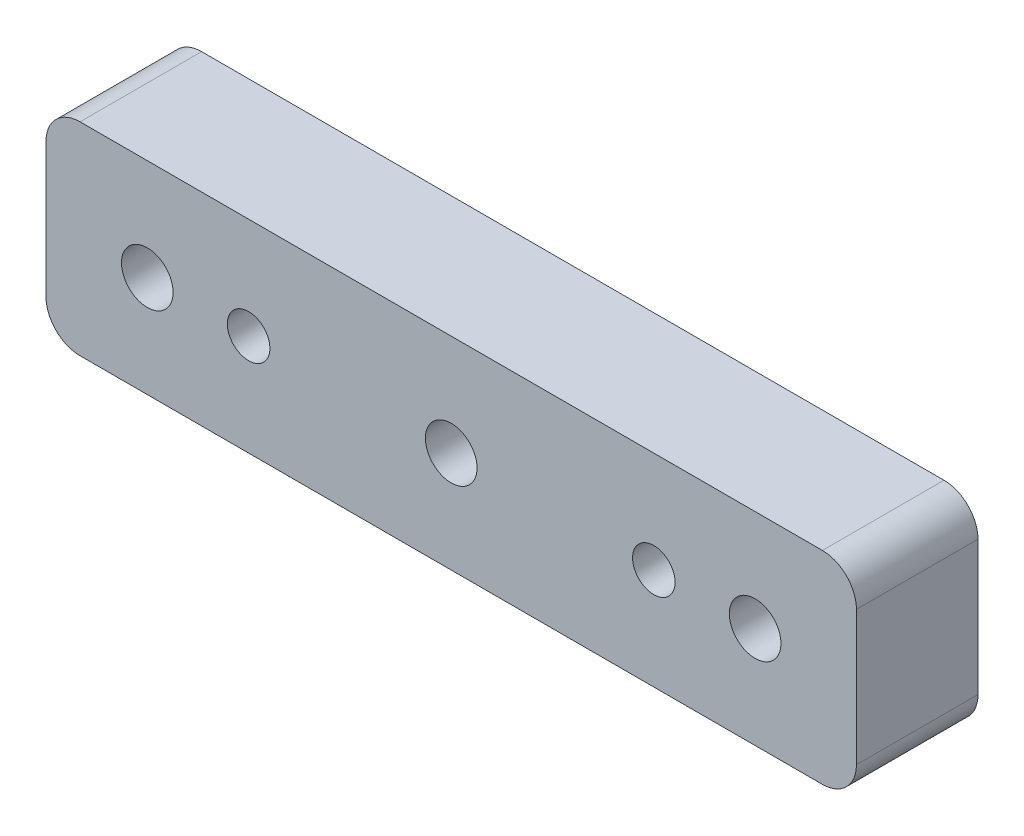
ISO-10303-21;
HEADER;
FILE_DESCRIPTION(('STEP AP214'),'2;1');
FILE_NAME('part.step','',(''),(''),'','','');
FILE_SCHEMA(('AUTOMOTIVE_DESIGN { 1 0 10303 214 1 1 1 1 }'));
ENDSEC;
DATA;
#1=APPLICATION_CONTEXT('core data for automotive mechanical design processes');
#2=APPLICATION_PROTOCOL_DEFINITION('international standard','automotive_design',2000,#1);
#3=PRODUCT_CONTEXT('',#1,'mechanical');
#4=PRODUCT('Part','Part','',(#3));
#5=PRODUCT_RELATED_PRODUCT_CATEGORY('part','',(#4));
#6=PRODUCT_DEFINITION_FORMATION('','',#4);
#7=PRODUCT_DEFINITION_CONTEXT('part definition',#1,'design');
#8=PRODUCT_DEFINITION('design','',#6,#7);
#9=PRODUCT_DEFINITION_SHAPE('','',#8);
#10=(LENGTH_UNIT() NAMED_UNIT(*) SI_UNIT(.MILLI.,.METRE.));
#11=(NAMED_UNIT(*) PLANE_ANGLE_UNIT() SI_UNIT($,.RADIAN.));
#12=(NAMED_UNIT(*) SI_UNIT($,.STERADIAN.) SOLID_ANGLE_UNIT());
#13=UNCERTAINTY_MEASURE_WITH_UNIT(LENGTH_MEASURE(1.E-05),#10,'distance_accuracy_value','');
#14=(GEOMETRIC_REPRESENTATION_CONTEXT(3) GLOBAL_UNCERTAINTY_ASSIGNED_CONTEXT((#13)) GLOBAL_UNIT_ASSIGNED_CONTEXT((#10,
#11,#12)) REPRESENTATION_CONTEXT('',''));
#15=CARTESIAN_POINT('',(0.,0.,0.));
#16=DIRECTION('',(0.,0.,1.));
#17=DIRECTION('',(1.,0.,0.));
#18=AXIS2_PLACEMENT_3D('',#15,#16,#17);
#19=CARTESIAN_POINT('',(36.64,6.64000000000001,12.));
#20=DIRECTION('',(0.,0.,-1.));
#21=DIRECTION('',(-1.,0.,0.));
#22=AXIS2_PLACEMENT_3D('',#19,#20,#21);
#23=CYLINDRICAL_SURFACE('',#22,3.36);
#24=CARTESIAN_POINT('',(36.64,6.64000000000001,0.));
#25=DIRECTION('',(0.,0.,1.));
#26=DIRECTION('',(1.,0.,0.));
#27=AXIS2_PLACEMENT_3D('',#24,#25,#26);
#28=CIRCLE('',#27,3.36);
#29=CARTESIAN_POINT('',(40.,6.64000000000001,0.));
#30=VERTEX_POINT('',#29);
#31=CARTESIAN_POINT('',(36.64,10.,0.));
#32=VERTEX_POINT('',#31);
#33=EDGE_CURVE('E131',#30,#32,#28,.T.);
#34=ORIENTED_EDGE('',*,*,#33,.T.);
#35=DIRECTION('',(0.,0.,-1.));
#36=VECTOR('',#35,1.);
#37=CARTESIAN_POINT('',(36.64,10.,12.));
#38=LINE('',#37,#36);
#39=CARTESIAN_POINT('',(36.64,10.,12.));
#40=VERTEX_POINT('',#39);
#41=EDGE_CURVE('E11',#40,#32,#38,.T.);
#42=ORIENTED_EDGE('',*,*,#41,.F.);
#43=CARTESIAN_POINT('',(36.64,6.64000000000001,12.));
#44=DIRECTION('',(0.,0.,1.));
#45=DIRECTION('',(1.,0.,0.));
#46=AXIS2_PLACEMENT_3D('',#43,#44,#45);
#47=CIRCLE('',#46,3.36);
#48=CARTESIAN_POINT('',(40.,6.64000000000001,12.));
#49=VERTEX_POINT('',#48);
#50=EDGE_CURVE('E146',#49,#40,#47,.T.);
#51=ORIENTED_EDGE('',*,*,#50,.F.);
#52=DIRECTION('',(0.,0.,-1.));
#53=VECTOR('',#52,1.);
#54=CARTESIAN_POINT('',(40.,6.64000000000001,12.));
#55=LINE('',#54,#53);
#56=EDGE_CURVE('E127',#49,#30,#55,.T.);
#57=ORIENTED_EDGE('',*,*,#56,.T.);
#58=EDGE_LOOP('',(#34,#42,#51,#57));
#59=FACE_BOUND('',#58,.T.);
#60=ADVANCED_FACE('F35',(#59),#23,.T.);
#61=CARTESIAN_POINT('',(36.64,10.,12.));
#62=DIRECTION('',(0.,-1.,0.));
#63=DIRECTION('',(1.,0.,0.));
#64=AXIS2_PLACEMENT_3D('',#61,#62,#63);
#65=PLANE('',#64);
#66=DIRECTION('',(-1.,0.,0.));
#67=VECTOR('',#66,1.);
#68=CARTESIAN_POINT('',(36.64,10.,0.));
#69=LINE('',#68,#67);
#70=CARTESIAN_POINT('',(-36.64,10.,0.));
#71=VERTEX_POINT('',#70);
#72=EDGE_CURVE('E134',#32,#71,#69,.T.);
#73=ORIENTED_EDGE('',*,*,#72,.T.);
#74=DIRECTION('',(0.,0.,-1.));
#75=VECTOR('',#74,1.);
#76=CARTESIAN_POINT('',(-36.64,10.,12.));
#77=LINE('',#76,#75);
#78=CARTESIAN_POINT('',(-36.64,10.,12.));
#79=VERTEX_POINT('',#78);
#80=EDGE_CURVE('E43',#79,#71,#77,.T.);
#81=ORIENTED_EDGE('',*,*,#80,.F.);
#82=DIRECTION('',(-1.,0.,0.));
#83=VECTOR('',#82,1.);
#84=CARTESIAN_POINT('',(36.64,10.,12.));
#85=LINE('',#84,#83);
#86=EDGE_CURVE('E94',#40,#79,#85,.T.);
#87=ORIENTED_EDGE('',*,*,#86,.F.);
#88=ORIENTED_EDGE('',*,*,#41,.T.);
#89=EDGE_LOOP('',(#73,#81,#87,#88));
#90=FACE_BOUND('',#89,.T.);
#91=ADVANCED_FACE('F239',(#90),#65,.F.);
#92=CARTESIAN_POINT('',(-36.64,6.64,12.));
#93=DIRECTION('',(0.,0.,-1.));
#94=DIRECTION('',(-1.,0.,0.));
#95=AXIS2_PLACEMENT_3D('',#92,#93,#94);
#96=CYLINDRICAL_SURFACE('',#95,3.36);
#97=CARTESIAN_POINT('',(-36.64,6.64,0.));
#98=DIRECTION('',(0.,0.,1.));
#99=DIRECTION('',(1.,0.,0.));
#100=AXIS2_PLACEMENT_3D('',#97,#98,#99);
#101=CIRCLE('',#100,3.36);
#102=CARTESIAN_POINT('',(-40.,6.64,0.));
#103=VERTEX_POINT('',#102);
#104=EDGE_CURVE('E137',#71,#103,#101,.T.);
#105=ORIENTED_EDGE('',*,*,#104,.T.);
#106=DIRECTION('',(0.,0.,-1.));
#107=VECTOR('',#106,1.);
#108=CARTESIAN_POINT('',(-40.,6.64,12.));
#109=LINE('',#108,#107);
#110=CARTESIAN_POINT('',(-40.,6.64,12.));
#111=VERTEX_POINT('',#110);
#112=EDGE_CURVE('E153',#111,#103,#109,.T.);
#113=ORIENTED_EDGE('',*,*,#112,.F.);
#114=CARTESIAN_POINT('',(-36.64,6.64,12.));
#115=DIRECTION('',(0.,0.,1.));
#116=DIRECTION('',(1.,0.,0.));
#117=AXIS2_PLACEMENT_3D('',#114,#115,#116);
#118=CIRCLE('',#117,3.36);
#119=EDGE_CURVE('E161',#79,#111,#118,.T.);
#120=ORIENTED_EDGE('',*,*,#119,.F.);
#121=ORIENTED_EDGE('',*,*,#80,.T.);
#122=EDGE_LOOP('',(#105,#113,#120,#121));
#123=FACE_BOUND('',#122,.T.);
#124=ADVANCED_FACE('F159',(#123),#96,.T.);
#125=CARTESIAN_POINT('',(-40.,-6.64,12.));
#126=DIRECTION('',(1.,0.,0.));
#127=DIRECTION('',(0.,0.,-1.));
#128=AXIS2_PLACEMENT_3D('',#125,#126,#127);
#129=PLANE('',#128);
#130=DIRECTION('',(0.,-1.,0.));
#131=VECTOR('',#130,1.);
#132=CARTESIAN_POINT('',(-40.,-6.64,0.));
#133=LINE('',#132,#131);
#134=CARTESIAN_POINT('',(-40.,-6.64,0.));
#135=VERTEX_POINT('',#134);
#136=EDGE_CURVE('E139',#103,#135,#133,.T.);
#137=ORIENTED_EDGE('',*,*,#136,.T.);
#138=DIRECTION('',(0.,0.,-1.));
#139=VECTOR('',#138,1.);
#140=CARTESIAN_POINT('',(-40.,-6.64,12.));
#141=LINE('',#140,#139);
#142=CARTESIAN_POINT('',(-40.,-6.64,12.));
#143=VERTEX_POINT('',#142);
#144=EDGE_CURVE('E150',#143,#135,#141,.T.);
#145=ORIENTED_EDGE('',*,*,#144,.F.);
#146=DIRECTION('',(0.,-1.,0.));
#147=VECTOR('',#146,1.);
#148=CARTESIAN_POINT('',(-40.,-6.64,12.));
#149=LINE('',#148,#147);
#150=EDGE_CURVE('E173',#111,#143,#149,.T.);
#151=ORIENTED_EDGE('',*,*,#150,.F.);
#152=ORIENTED_EDGE('',*,*,#112,.T.);
#153=EDGE_LOOP('',(#137,#145,#151,#152));
#154=FACE_BOUND('',#153,.T.);
#155=ADVANCED_FACE('F169',(#154),#129,.F.);
#156=CARTESIAN_POINT('',(-36.64,-6.64,12.));
#157=DIRECTION('',(0.,0.,-1.));
#158=DIRECTION('',(-1.,0.,0.));
#159=AXIS2_PLACEMENT_3D('',#156,#157,#158);
#160=CYLINDRICAL_SURFACE('',#159,3.36);
#161=CARTESIAN_POINT('',(-36.64,-6.64,0.));
#162=DIRECTION('',(0.,0.,1.));
#163=DIRECTION('',(-1.,0.,0.));
#164=AXIS2_PLACEMENT_3D('',#161,#162,#163);
#165=CIRCLE('',#164,3.36);
#166=CARTESIAN_POINT('',(-36.64,-10.,0.));
#167=VERTEX_POINT('',#166);
#168=EDGE_CURVE('E141',#135,#167,#165,.T.);
#169=ORIENTED_EDGE('',*,*,#168,.T.);
#170=DIRECTION('',(0.,0.,-1.));
#171=VECTOR('',#170,1.);
#172=CARTESIAN_POINT('',(-36.64,-10.,12.));
#173=LINE('',#172,#171);
#174=CARTESIAN_POINT('',(-36.64,-10.,12.));
#175=VERTEX_POINT('',#174);
#176=EDGE_CURVE('E122',#175,#167,#173,.T.);
#177=ORIENTED_EDGE('',*,*,#176,.F.);
#178=CARTESIAN_POINT('',(-36.64,-6.64,12.));
#179=DIRECTION('',(0.,0.,1.));
#180=DIRECTION('',(-1.,0.,0.));
#181=AXIS2_PLACEMENT_3D('',#178,#179,#180);
#182=CIRCLE('',#181,3.36);
#183=EDGE_CURVE('E113',#143,#175,#182,.T.);
#184=ORIENTED_EDGE('',*,*,#183,.F.);
#185=ORIENTED_EDGE('',*,*,#144,.T.);
#186=EDGE_LOOP('',(#169,#177,#184,#185));
#187=FACE_BOUND('',#186,.T.);
#188=ADVANCED_FACE('F172',(#187),#160,.T.);
#189=CARTESIAN_POINT('',(36.64,-9.99999999999999,12.));
#190=DIRECTION('',(0.,1.,0.));
#191=DIRECTION('',(-1.,0.,0.));
#192=AXIS2_PLACEMENT_3D('',#189,#190,#191);
#193=PLANE('',#192);
#194=DIRECTION('',(1.,0.,0.));
#195=VECTOR('',#194,1.);
#196=CARTESIAN_POINT('',(36.64,-9.99999999999999,0.));
#197=LINE('',#196,#195);
#198=CARTESIAN_POINT('',(36.64,-9.99999999999999,0.));
#199=VERTEX_POINT('',#198);
#200=EDGE_CURVE('E121',#167,#199,#197,.T.);
#201=ORIENTED_EDGE('',*,*,#200,.T.);
#202=DIRECTION('',(0.,0.,-1.));
#203=VECTOR('',#202,1.);
#204=CARTESIAN_POINT('',(36.64,-9.99999999999999,12.));
#205=LINE('',#204,#203);
#206=CARTESIAN_POINT('',(36.64,-9.99999999999999,12.));
#207=VERTEX_POINT('',#206);
#208=EDGE_CURVE('E118',#207,#199,#205,.T.);
#209=ORIENTED_EDGE('',*,*,#208,.F.);
#210=DIRECTION('',(1.,0.,0.));
#211=VECTOR('',#210,1.);
#212=CARTESIAN_POINT('',(36.64,-9.99999999999999,12.));
#213=LINE('',#212,#211);
#214=EDGE_CURVE('E107',#175,#207,#213,.T.);
#215=ORIENTED_EDGE('',*,*,#214,.F.);
#216=ORIENTED_EDGE('',*,*,#176,.T.);
#217=EDGE_LOOP('',(#201,#209,#215,#216));
#218=FACE_BOUND('',#217,.T.);
#219=ADVANCED_FACE('F119',(#218),#193,.F.);
#220=CARTESIAN_POINT('',(36.64,-6.63999999999999,12.));
#221=DIRECTION('',(0.,0.,-1.));
#222=DIRECTION('',(-1.,0.,0.));
#223=AXIS2_PLACEMENT_3D('',#220,#221,#222);
#224=CYLINDRICAL_SURFACE('',#223,3.36);
#225=CARTESIAN_POINT('',(36.64,-6.63999999999999,0.));
#226=DIRECTION('',(0.,0.,1.));
#227=DIRECTION('',(1.,0.,0.));
#228=AXIS2_PLACEMENT_3D('',#225,#226,#227);
#229=CIRCLE('',#228,3.36);
#230=CARTESIAN_POINT('',(40.,-6.63999999999999,0.));
#231=VERTEX_POINT('',#230);
#232=EDGE_CURVE('E80',#199,#231,#229,.T.);
#233=ORIENTED_EDGE('',*,*,#232,.T.);
#234=DIRECTION('',(0.,0.,-1.));
#235=VECTOR('',#234,1.);
#236=CARTESIAN_POINT('',(40.,-6.63999999999999,12.));
#237=LINE('',#236,#235);
#238=CARTESIAN_POINT('',(40.,-6.63999999999999,12.));
#239=VERTEX_POINT('',#238);
#240=EDGE_CURVE('E123',#239,#231,#237,.T.);
#241=ORIENTED_EDGE('',*,*,#240,.F.);
#242=CARTESIAN_POINT('',(36.64,-6.63999999999999,12.));
#243=DIRECTION('',(0.,0.,1.));
#244=DIRECTION('',(1.,0.,0.));
#245=AXIS2_PLACEMENT_3D('',#242,#243,#244);
#246=CIRCLE('',#245,3.36);
#247=EDGE_CURVE('E111',#207,#239,#246,.T.);
#248=ORIENTED_EDGE('',*,*,#247,.F.);
#249=ORIENTED_EDGE('',*,*,#208,.T.);
#250=EDGE_LOOP('',(#233,#241,#248,#249));
#251=FACE_BOUND('',#250,.T.);
#252=ADVANCED_FACE('F125',(#251),#224,.T.);
#253=CARTESIAN_POINT('',(40.,-6.63999999999999,12.));
#254=DIRECTION('',(-1.,0.,0.));
#255=DIRECTION('',(0.,0.,1.));
#256=AXIS2_PLACEMENT_3D('',#253,#254,#255);
#257=PLANE('',#256);
#258=DIRECTION('',(0.,1.,0.));
#259=VECTOR('',#258,1.);
#260=CARTESIAN_POINT('',(40.,-6.63999999999999,0.));
#261=LINE('',#260,#259);
#262=EDGE_CURVE('E86',#231,#30,#261,.T.);
#263=ORIENTED_EDGE('',*,*,#262,.T.);
#264=ORIENTED_EDGE('',*,*,#56,.F.);
#265=DIRECTION('',(0.,1.,0.));
#266=VECTOR('',#265,1.);
#267=CARTESIAN_POINT('',(40.,-6.63999999999999,12.));
#268=LINE('',#267,#266);
#269=EDGE_CURVE('E51',#239,#49,#268,.T.);
#270=ORIENTED_EDGE('',*,*,#269,.F.);
#271=ORIENTED_EDGE('',*,*,#240,.T.);
#272=EDGE_LOOP('',(#263,#264,#270,#271));
#273=FACE_BOUND('',#272,.T.);
#274=ADVANCED_FACE('F213',(#273),#257,.F.);
#275=CARTESIAN_POINT('',(36.64,6.64000000000001,12.));
#276=DIRECTION('',(0.,0.,1.));
#277=DIRECTION('',(1.,0.,0.));
#278=AXIS2_PLACEMENT_3D('',#275,#276,#277);
#279=PLANE('',#278);
#280=CARTESIAN_POINT('',(-20.,0.,12.));
#281=DIRECTION('',(0.,0.,1.));
#282=DIRECTION('',(1.,0.,0.));
#283=AXIS2_PLACEMENT_3D('',#280,#281,#282);
#284=CIRCLE('',#283,2.09999999999999);
#285=CARTESIAN_POINT('',(-17.9,0.,12.));
#286=VERTEX_POINT('',#285);
#287=EDGE_CURVE('E205',#286,#286,#284,.T.);
#288=ORIENTED_EDGE('',*,*,#287,.F.);
#289=EDGE_LOOP('',(#288));
#290=FACE_BOUND('',#289,.T.);
#291=CARTESIAN_POINT('',(20.,0.,12.));
#292=DIRECTION('',(0.,0.,1.));
#293=DIRECTION('',(1.,0.,0.));
#294=AXIS2_PLACEMENT_3D('',#291,#292,#293);
#295=CIRCLE('',#294,2.09999999999999);
#296=CARTESIAN_POINT('',(22.1,0.,12.));
#297=VERTEX_POINT('',#296);
#298=EDGE_CURVE('E199',#297,#297,#295,.T.);
#299=ORIENTED_EDGE('',*,*,#298,.F.);
#300=EDGE_LOOP('',(#299));
#301=FACE_BOUND('',#300,.T.);
#302=CARTESIAN_POINT('',(30.,0.,12.));
#303=DIRECTION('',(0.,0.,1.));
#304=DIRECTION('',(-1.,0.,0.));
#305=AXIS2_PLACEMENT_3D('',#302,#303,#304);
#306=CIRCLE('',#305,2.55);
#307=CARTESIAN_POINT('',(27.45,0.,12.));
#308=VERTEX_POINT('',#307);
#309=EDGE_CURVE('E191',#308,#308,#306,.T.);
#310=ORIENTED_EDGE('',*,*,#309,.F.);
#311=EDGE_LOOP('',(#310));
#312=FACE_BOUND('',#311,.T.);
#313=CARTESIAN_POINT('',(-30.,0.,12.));
#314=DIRECTION('',(0.,0.,1.));
#315=DIRECTION('',(1.,0.,0.));
#316=AXIS2_PLACEMENT_3D('',#313,#314,#315);
#317=CIRCLE('',#316,2.55);
#318=CARTESIAN_POINT('',(-27.45,0.,12.));
#319=VERTEX_POINT('',#318);
#320=EDGE_CURVE('E185',#319,#319,#317,.T.);
#321=ORIENTED_EDGE('',*,*,#320,.F.);
#322=EDGE_LOOP('',(#321));
#323=FACE_BOUND('',#322,.T.);
#324=CARTESIAN_POINT('',(0.,0.,12.));
#325=DIRECTION('',(0.,0.,1.));
#326=DIRECTION('',(1.,0.,0.));
#327=AXIS2_PLACEMENT_3D('',#324,#325,#326);
#328=CIRCLE('',#327,2.55);
#329=CARTESIAN_POINT('',(2.55,0.,12.));
#330=VERTEX_POINT('',#329);
#331=EDGE_CURVE('E179',#330,#330,#328,.T.);
#332=ORIENTED_EDGE('',*,*,#331,.F.);
#333=EDGE_LOOP('',(#332));
#334=FACE_BOUND('',#333,.T.);
#335=ORIENTED_EDGE('',*,*,#50,.T.);
#336=ORIENTED_EDGE('',*,*,#86,.T.);
#337=ORIENTED_EDGE('',*,*,#119,.T.);
#338=ORIENTED_EDGE('',*,*,#150,.T.);
#339=ORIENTED_EDGE('',*,*,#183,.T.);
#340=ORIENTED_EDGE('',*,*,#214,.T.);
#341=ORIENTED_EDGE('',*,*,#247,.T.);
#342=ORIENTED_EDGE('',*,*,#269,.T.);
#343=EDGE_LOOP('',(#335,#336,#337,#338,#339,#340,#341,#342));
#344=FACE_BOUND('',#343,.T.);
#345=ADVANCED_FACE('F109',(#290,#301,#312,#323,#334,#344),#279,.T.);
#346=CARTESIAN_POINT('',(36.64,6.64000000000001,0.));
#347=DIRECTION('',(0.,0.,1.));
#348=DIRECTION('',(1.,0.,0.));
#349=AXIS2_PLACEMENT_3D('',#346,#347,#348);
#350=PLANE('',#349);
#351=CARTESIAN_POINT('',(-20.,0.,0.));
#352=DIRECTION('',(0.,0.,1.));
#353=DIRECTION('',(1.,0.,0.));
#354=AXIS2_PLACEMENT_3D('',#351,#352,#353);
#355=CIRCLE('',#354,2.1);
#356=CARTESIAN_POINT('',(-17.9,0.,0.));
#357=VERTEX_POINT('',#356);
#358=EDGE_CURVE('E202',#357,#357,#355,.T.);
#359=ORIENTED_EDGE('',*,*,#358,.T.);
#360=EDGE_LOOP('',(#359));
#361=FACE_BOUND('',#360,.T.);
#362=CARTESIAN_POINT('',(20.,0.,0.));
#363=DIRECTION('',(0.,0.,1.));
#364=DIRECTION('',(1.,0.,0.));
#365=AXIS2_PLACEMENT_3D('',#362,#363,#364);
#366=CIRCLE('',#365,2.1);
#367=CARTESIAN_POINT('',(22.1,0.,0.));
#368=VERTEX_POINT('',#367);
#369=EDGE_CURVE('E194',#368,#368,#366,.T.);
#370=ORIENTED_EDGE('',*,*,#369,.T.);
#371=EDGE_LOOP('',(#370));
#372=FACE_BOUND('',#371,.T.);
#373=CARTESIAN_POINT('',(30.,0.,0.));
#374=DIRECTION('',(0.,0.,1.));
#375=DIRECTION('',(-1.,0.,0.));
#376=AXIS2_PLACEMENT_3D('',#373,#374,#375);
#377=CIRCLE('',#376,2.55);
#378=CARTESIAN_POINT('',(27.45,0.,0.));
#379=VERTEX_POINT('',#378);
#380=EDGE_CURVE('E188',#379,#379,#377,.T.);
#381=ORIENTED_EDGE('',*,*,#380,.T.);
#382=EDGE_LOOP('',(#381));
#383=FACE_BOUND('',#382,.T.);
#384=CARTESIAN_POINT('',(-30.,0.,0.));
#385=DIRECTION('',(0.,0.,1.));
#386=DIRECTION('',(1.,0.,0.));
#387=AXIS2_PLACEMENT_3D('',#384,#385,#386);
#388=CIRCLE('',#387,2.55);
#389=CARTESIAN_POINT('',(-27.45,0.,0.));
#390=VERTEX_POINT('',#389);
#391=EDGE_CURVE('E182',#390,#390,#388,.T.);
#392=ORIENTED_EDGE('',*,*,#391,.T.);
#393=EDGE_LOOP('',(#392));
#394=FACE_BOUND('',#393,.T.);
#395=CARTESIAN_POINT('',(0.,0.,0.));
#396=DIRECTION('',(0.,0.,1.));
#397=DIRECTION('',(1.,0.,0.));
#398=AXIS2_PLACEMENT_3D('',#395,#396,#397);
#399=CIRCLE('',#398,2.55);
#400=CARTESIAN_POINT('',(2.55,0.,0.));
#401=VERTEX_POINT('',#400);
#402=EDGE_CURVE('E135',#401,#401,#399,.T.);
#403=ORIENTED_EDGE('',*,*,#402,.T.);
#404=EDGE_LOOP('',(#403));
#405=FACE_BOUND('',#404,.T.);
#406=ORIENTED_EDGE('',*,*,#33,.F.);
#407=ORIENTED_EDGE('',*,*,#262,.F.);
#408=ORIENTED_EDGE('',*,*,#232,.F.);
#409=ORIENTED_EDGE('',*,*,#200,.F.);
#410=ORIENTED_EDGE('',*,*,#168,.F.);
#411=ORIENTED_EDGE('',*,*,#136,.F.);
#412=ORIENTED_EDGE('',*,*,#104,.F.);
#413=ORIENTED_EDGE('',*,*,#72,.F.);
#414=EDGE_LOOP('',(#406,#407,#408,#409,#410,#411,#412,#413));
#415=FACE_BOUND('',#414,.T.);
#416=ADVANCED_FACE('F165',(#361,#372,#383,#394,#405,#415),#350,.F.);
#417=CARTESIAN_POINT('',(0.,0.,0.));
#418=DIRECTION('',(0.,0.,1.));
#419=DIRECTION('',(1.,0.,0.));
#420=AXIS2_PLACEMENT_3D('',#417,#418,#419);
#421=CYLINDRICAL_SURFACE('',#420,2.55);
#422=ORIENTED_EDGE('',*,*,#402,.F.);
#423=EDGE_LOOP('',(#422));
#424=FACE_BOUND('',#423,.T.);
#425=ORIENTED_EDGE('',*,*,#331,.T.);
#426=EDGE_LOOP('',(#425));
#427=FACE_BOUND('',#426,.T.);
#428=ADVANCED_FACE('F223',(#424,#427),#421,.F.);
#429=CARTESIAN_POINT('',(-30.,0.,0.));
#430=DIRECTION('',(0.,0.,1.));
#431=DIRECTION('',(1.,0.,0.));
#432=AXIS2_PLACEMENT_3D('',#429,#430,#431);
#433=CYLINDRICAL_SURFACE('',#432,2.55);
#434=ORIENTED_EDGE('',*,*,#391,.F.);
#435=EDGE_LOOP('',(#434));
#436=FACE_BOUND('',#435,.T.);
#437=ORIENTED_EDGE('',*,*,#320,.T.);
#438=EDGE_LOOP('',(#437));
#439=FACE_BOUND('',#438,.T.);
#440=ADVANCED_FACE('F225',(#436,#439),#433,.F.);
#441=CARTESIAN_POINT('',(30.,0.,0.));
#442=DIRECTION('',(0.,0.,1.));
#443=DIRECTION('',(1.,0.,0.));
#444=AXIS2_PLACEMENT_3D('',#441,#442,#443);
#445=CYLINDRICAL_SURFACE('',#444,2.55);
#446=ORIENTED_EDGE('',*,*,#380,.F.);
#447=EDGE_LOOP('',(#446));
#448=FACE_BOUND('',#447,.T.);
#449=ORIENTED_EDGE('',*,*,#309,.T.);
#450=EDGE_LOOP('',(#449));
#451=FACE_BOUND('',#450,.T.);
#452=ADVANCED_FACE('F232',(#448,#451),#445,.F.);
#453=CARTESIAN_POINT('',(20.,0.,12.));
#454=DIRECTION('',(0.,0.,1.));
#455=DIRECTION('',(1.,0.,0.));
#456=AXIS2_PLACEMENT_3D('',#453,#454,#455);
#457=CYLINDRICAL_SURFACE('',#456,2.09999999999999);
#458=ORIENTED_EDGE('',*,*,#369,.F.);
#459=EDGE_LOOP('',(#458));
#460=FACE_BOUND('',#459,.T.);
#461=ORIENTED_EDGE('',*,*,#298,.T.);
#462=EDGE_LOOP('',(#461));
#463=FACE_BOUND('',#462,.T.);
#464=ADVANCED_FACE('F305',(#460,#463),#457,.F.);
#465=CARTESIAN_POINT('',(-20.,0.,12.));
#466=DIRECTION('',(0.,0.,1.));
#467=DIRECTION('',(1.,0.,0.));
#468=AXIS2_PLACEMENT_3D('',#465,#466,#467);
#469=CYLINDRICAL_SURFACE('',#468,2.09999999999999);
#470=ORIENTED_EDGE('',*,*,#358,.F.);
#471=EDGE_LOOP('',(#470));
#472=FACE_BOUND('',#471,.T.);
#473=ORIENTED_EDGE('',*,*,#287,.T.);
#474=EDGE_LOOP('',(#473));
#475=FACE_BOUND('',#474,.T.);
#476=ADVANCED_FACE('F209',(#472,#475),#469,.F.);
#477=CLOSED_SHELL('',(#60,#91,#124,#155,#188,#219,#252,#274,#345,#416,#428,#440,#452,#464,#476));
#478=MANIFOLD_SOLID_BREP('B2',#477);
#479=ADVANCED_BREP_SHAPE_REPRESENTATION('',(#18,#478),#14);
#480=SHAPE_DEFINITION_REPRESENTATION(#9,#479);
ENDSEC;
END-ISO-10303-21;
